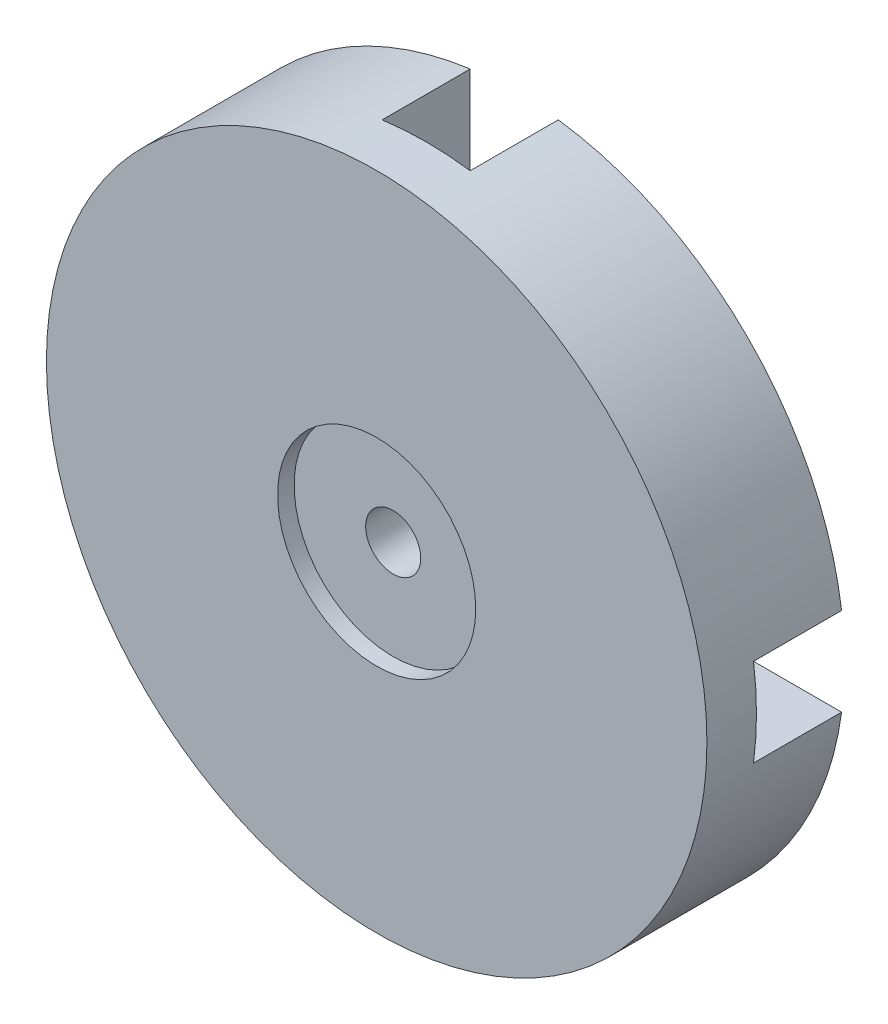
ISO-10303-21;
HEADER;
FILE_DESCRIPTION(('STEP AP214'),'2;1');
FILE_NAME('part.step','',(''),(''),'','','');
FILE_SCHEMA(('AUTOMOTIVE_DESIGN { 1 0 10303 214 1 1 1 1 }'));
ENDSEC;
DATA;
#1=APPLICATION_CONTEXT('core data for automotive mechanical design processes');
#2=APPLICATION_PROTOCOL_DEFINITION('international standard','automotive_design',2000,#1);
#3=PRODUCT_CONTEXT('',#1,'mechanical');
#4=PRODUCT('Part','Part','',(#3));
#5=PRODUCT_RELATED_PRODUCT_CATEGORY('part','',(#4));
#6=PRODUCT_DEFINITION_FORMATION('','',#4);
#7=PRODUCT_DEFINITION_CONTEXT('part definition',#1,'design');
#8=PRODUCT_DEFINITION('design','',#6,#7);
#9=PRODUCT_DEFINITION_SHAPE('','',#8);
#10=(LENGTH_UNIT() NAMED_UNIT(*) SI_UNIT(.MILLI.,.METRE.));
#11=(NAMED_UNIT(*) PLANE_ANGLE_UNIT() SI_UNIT($,.RADIAN.));
#12=(NAMED_UNIT(*) SI_UNIT($,.STERADIAN.) SOLID_ANGLE_UNIT());
#13=UNCERTAINTY_MEASURE_WITH_UNIT(LENGTH_MEASURE(1.E-05),#10,'distance_accuracy_value','');
#14=(GEOMETRIC_REPRESENTATION_CONTEXT(3) GLOBAL_UNCERTAINTY_ASSIGNED_CONTEXT((#13)) GLOBAL_UNIT_ASSIGNED_CONTEXT((#10,
#11,#12)) REPRESENTATION_CONTEXT('',''));
#15=CARTESIAN_POINT('',(0.,0.,0.));
#16=DIRECTION('',(0.,0.,1.));
#17=DIRECTION('',(1.,0.,0.));
#18=AXIS2_PLACEMENT_3D('',#15,#16,#17);
#19=CARTESIAN_POINT('',(0.,0.,25.));
#20=DIRECTION('',(0.,0.,-1.));
#21=DIRECTION('',(-1.,0.,0.));
#22=AXIS2_PLACEMENT_3D('',#19,#20,#21);
#23=CYLINDRICAL_SURFACE('',#22,60.);
#24=CARTESIAN_POINT('',(0.,0.,0.));
#25=DIRECTION('',(0.,0.,1.));
#26=DIRECTION('',(1.,0.,0.));
#27=AXIS2_PLACEMENT_3D('',#24,#25,#26);
#28=CIRCLE('',#27,60.);
#29=CARTESIAN_POINT('',(-7.99999999999999,59.464274989274,0.));
#30=VERTEX_POINT('',#29);
#31=CARTESIAN_POINT('',(-59.464274989274,8.,0.));
#32=VERTEX_POINT('',#31);
#33=EDGE_CURVE('E317',#30,#32,#28,.T.);
#34=ORIENTED_EDGE('',*,*,#33,.T.);
#35=DIRECTION('',(0.,0.,-1.));
#36=VECTOR('',#35,1.);
#37=CARTESIAN_POINT('',(-59.464274989274,8.,25.));
#38=LINE('',#37,#36);
#39=CARTESIAN_POINT('',(-59.464274989274,8.,16.));
#40=VERTEX_POINT('',#39);
#41=EDGE_CURVE('E242',#32,#40,#38,.F.);
#42=ORIENTED_EDGE('',*,*,#41,.T.);
#43=CARTESIAN_POINT('',(0.,0.,16.));
#44=DIRECTION('',(0.,0.,1.));
#45=DIRECTION('',(1.,0.,0.));
#46=AXIS2_PLACEMENT_3D('',#43,#44,#45);
#47=CIRCLE('',#46,60.);
#48=CARTESIAN_POINT('',(-59.464274989274,-8.,16.));
#49=VERTEX_POINT('',#48);
#50=EDGE_CURVE('E11',#40,#49,#47,.T.);
#51=ORIENTED_EDGE('',*,*,#50,.T.);
#52=DIRECTION('',(0.,0.,-1.));
#53=VECTOR('',#52,1.);
#54=CARTESIAN_POINT('',(-59.464274989274,-8.,25.));
#55=LINE('',#54,#53);
#56=CARTESIAN_POINT('',(-59.464274989274,-8.,0.));
#57=VERTEX_POINT('',#56);
#58=EDGE_CURVE('E159',#49,#57,#55,.T.);
#59=ORIENTED_EDGE('',*,*,#58,.T.);
#60=CARTESIAN_POINT('',(-8.,-59.464274989274,0.));
#61=VERTEX_POINT('',#60);
#62=EDGE_CURVE('E263',#57,#61,#28,.T.);
#63=ORIENTED_EDGE('',*,*,#62,.T.);
#64=DIRECTION('',(0.,0.,-1.));
#65=VECTOR('',#64,1.);
#66=CARTESIAN_POINT('',(-8.,-59.464274989274,25.));
#67=LINE('',#66,#65);
#68=CARTESIAN_POINT('',(-8.,-59.464274989274,16.));
#69=VERTEX_POINT('',#68);
#70=EDGE_CURVE('E238',#61,#69,#67,.F.);
#71=ORIENTED_EDGE('',*,*,#70,.T.);
#72=CARTESIAN_POINT('',(0.,0.,16.));
#73=DIRECTION('',(0.,0.,1.));
#74=DIRECTION('',(1.,0.,0.));
#75=AXIS2_PLACEMENT_3D('',#72,#73,#74);
#76=CIRCLE('',#75,60.);
#77=CARTESIAN_POINT('',(7.99999999999999,-59.464274989274,16.));
#78=VERTEX_POINT('',#77);
#79=EDGE_CURVE('E40',#69,#78,#76,.T.);
#80=ORIENTED_EDGE('',*,*,#79,.T.);
#81=DIRECTION('',(0.,0.,-1.));
#82=VECTOR('',#81,1.);
#83=CARTESIAN_POINT('',(8.,-59.464274989274,25.));
#84=LINE('',#83,#82);
#85=CARTESIAN_POINT('',(8.,-59.464274989274,0.));
#86=VERTEX_POINT('',#85);
#87=EDGE_CURVE('E235',#78,#86,#84,.T.);
#88=ORIENTED_EDGE('',*,*,#87,.T.);
#89=CARTESIAN_POINT('',(59.464274989274,-8.00000000000001,0.));
#90=VERTEX_POINT('',#89);
#91=EDGE_CURVE('E252',#86,#90,#28,.T.);
#92=ORIENTED_EDGE('',*,*,#91,.T.);
#93=DIRECTION('',(0.,0.,-1.));
#94=VECTOR('',#93,1.);
#95=CARTESIAN_POINT('',(59.464274989274,-8.00000000000001,25.));
#96=LINE('',#95,#94);
#97=CARTESIAN_POINT('',(59.464274989274,-8.,16.));
#98=VERTEX_POINT('',#97);
#99=EDGE_CURVE('E232',#90,#98,#96,.F.);
#100=ORIENTED_EDGE('',*,*,#99,.T.);
#101=CARTESIAN_POINT('',(0.,0.,16.));
#102=DIRECTION('',(0.,0.,1.));
#103=DIRECTION('',(1.,0.,0.));
#104=AXIS2_PLACEMENT_3D('',#101,#102,#103);
#105=CIRCLE('',#104,60.);
#106=CARTESIAN_POINT('',(59.464274989274,7.99999999999999,16.));
#107=VERTEX_POINT('',#106);
#108=EDGE_CURVE('E280',#98,#107,#105,.T.);
#109=ORIENTED_EDGE('',*,*,#108,.T.);
#110=DIRECTION('',(0.,0.,-1.));
#111=VECTOR('',#110,1.);
#112=CARTESIAN_POINT('',(59.464274989274,7.99999999999999,25.));
#113=LINE('',#112,#111);
#114=CARTESIAN_POINT('',(59.464274989274,7.99999999999999,0.));
#115=VERTEX_POINT('',#114);
#116=EDGE_CURVE('E229',#107,#115,#113,.T.);
#117=ORIENTED_EDGE('',*,*,#116,.T.);
#118=CARTESIAN_POINT('',(8.00000000000001,59.464274989274,0.));
#119=VERTEX_POINT('',#118);
#120=EDGE_CURVE('E260',#115,#119,#28,.T.);
#121=ORIENTED_EDGE('',*,*,#120,.T.);
#122=DIRECTION('',(0.,0.,-1.));
#123=VECTOR('',#122,1.);
#124=CARTESIAN_POINT('',(8.00000000000001,59.464274989274,25.));
#125=LINE('',#124,#123);
#126=CARTESIAN_POINT('',(8.00000000000001,59.464274989274,16.));
#127=VERTEX_POINT('',#126);
#128=EDGE_CURVE('E226',#119,#127,#125,.F.);
#129=ORIENTED_EDGE('',*,*,#128,.T.);
#130=CARTESIAN_POINT('',(0.,0.,16.));
#131=DIRECTION('',(0.,0.,1.));
#132=DIRECTION('',(1.,0.,0.));
#133=AXIS2_PLACEMENT_3D('',#130,#131,#132);
#134=CIRCLE('',#133,60.);
#135=CARTESIAN_POINT('',(-7.99999999999999,59.464274989274,16.));
#136=VERTEX_POINT('',#135);
#137=EDGE_CURVE('E277',#127,#136,#134,.T.);
#138=ORIENTED_EDGE('',*,*,#137,.T.);
#139=DIRECTION('',(0.,0.,-1.));
#140=VECTOR('',#139,1.);
#141=CARTESIAN_POINT('',(-7.99999999999999,59.464274989274,25.));
#142=LINE('',#141,#140);
#143=EDGE_CURVE('E172',#136,#30,#142,.T.);
#144=ORIENTED_EDGE('',*,*,#143,.T.);
#145=EDGE_LOOP('',(#34,#42,#51,#59,#63,#71,#80,#88,#92,#100,#109,#117,#121,#129,#138,#144));
#146=FACE_BOUND('',#145,.T.);
#147=CARTESIAN_POINT('',(0.,0.,25.));
#148=DIRECTION('',(0.,0.,1.));
#149=DIRECTION('',(1.,0.,0.));
#150=AXIS2_PLACEMENT_3D('',#147,#148,#149);
#151=CIRCLE('',#150,60.);
#152=CARTESIAN_POINT('',(60.,0.,25.));
#153=VERTEX_POINT('',#152);
#154=EDGE_CURVE('E256',#153,#153,#151,.T.);
#155=ORIENTED_EDGE('',*,*,#154,.F.);
#156=EDGE_LOOP('',(#155));
#157=FACE_BOUND('',#156,.T.);
#158=ADVANCED_FACE('F33',(#146,#157),#23,.T.);
#159=CARTESIAN_POINT('',(0.,0.,25.));
#160=DIRECTION('',(0.,0.,1.));
#161=DIRECTION('',(1.,0.,0.));
#162=AXIS2_PLACEMENT_3D('',#159,#160,#161);
#163=PLANE('',#162);
#164=CARTESIAN_POINT('',(0.,0.,25.));
#165=DIRECTION('',(0.,0.,1.));
#166=DIRECTION('',(1.,0.,0.));
#167=AXIS2_PLACEMENT_3D('',#164,#165,#166);
#168=CIRCLE('',#167,18.);
#169=CARTESIAN_POINT('',(18.,0.,25.));
#170=VERTEX_POINT('',#169);
#171=EDGE_CURVE('E253',#170,#170,#168,.T.);
#172=ORIENTED_EDGE('',*,*,#171,.F.);
#173=EDGE_LOOP('',(#172));
#174=FACE_BOUND('',#173,.T.);
#175=ORIENTED_EDGE('',*,*,#154,.T.);
#176=EDGE_LOOP('',(#175));
#177=FACE_BOUND('',#176,.T.);
#178=ADVANCED_FACE('F332',(#174,#177),#163,.T.);
#179=CARTESIAN_POINT('',(0.,0.,0.));
#180=DIRECTION('',(0.,0.,1.));
#181=DIRECTION('',(1.,0.,0.));
#182=AXIS2_PLACEMENT_3D('',#179,#180,#181);
#183=PLANE('',#182);
#184=CARTESIAN_POINT('',(0.,0.,0.));
#185=DIRECTION('',(0.,0.,1.));
#186=DIRECTION('',(1.,0.,0.));
#187=AXIS2_PLACEMENT_3D('',#184,#185,#186);
#188=CIRCLE('',#187,5.);
#189=CARTESIAN_POINT('',(5.,0.,0.));
#190=VERTEX_POINT('',#189);
#191=EDGE_CURVE('E245',#190,#190,#188,.T.);
#192=ORIENTED_EDGE('',*,*,#191,.T.);
#193=EDGE_LOOP('',(#192));
#194=FACE_BOUND('',#193,.T.);
#195=DIRECTION('',(0.,-1.,0.));
#196=VECTOR('',#195,1.);
#197=CARTESIAN_POINT('',(-15.,-8.,0.));
#198=LINE('',#197,#196);
#199=CARTESIAN_POINT('',(-15.,8.,0.));
#200=VERTEX_POINT('',#199);
#201=CARTESIAN_POINT('',(-15.,-8.,0.));
#202=VERTEX_POINT('',#201);
#203=EDGE_CURVE('E47',#200,#202,#198,.T.);
#204=ORIENTED_EDGE('',*,*,#203,.F.);
#205=DIRECTION('',(-1.,0.,0.));
#206=VECTOR('',#205,1.);
#207=CARTESIAN_POINT('',(0.,8.,0.));
#208=LINE('',#207,#206);
#209=EDGE_CURVE('E274',#200,#32,#208,.T.);
#210=ORIENTED_EDGE('',*,*,#209,.T.);
#211=ORIENTED_EDGE('',*,*,#33,.F.);
#212=DIRECTION('',(0.,1.,0.));
#213=VECTOR('',#212,1.);
#214=CARTESIAN_POINT('',(-8.,15.,0.));
#215=LINE('',#214,#213);
#216=CARTESIAN_POINT('',(-8.,15.,0.));
#217=VERTEX_POINT('',#216);
#218=EDGE_CURVE('E211',#217,#30,#215,.T.);
#219=ORIENTED_EDGE('',*,*,#218,.F.);
#220=DIRECTION('',(-1.,0.,0.));
#221=VECTOR('',#220,1.);
#222=CARTESIAN_POINT('',(-8.,15.,0.));
#223=LINE('',#222,#221);
#224=CARTESIAN_POINT('',(8.,15.,0.));
#225=VERTEX_POINT('',#224);
#226=EDGE_CURVE('E217',#225,#217,#223,.T.);
#227=ORIENTED_EDGE('',*,*,#226,.F.);
#228=DIRECTION('',(0.,1.,0.));
#229=VECTOR('',#228,1.);
#230=CARTESIAN_POINT('',(8.,0.,0.));
#231=LINE('',#230,#229);
#232=EDGE_CURVE('E259',#225,#119,#231,.T.);
#233=ORIENTED_EDGE('',*,*,#232,.T.);
#234=ORIENTED_EDGE('',*,*,#120,.F.);
#235=DIRECTION('',(1.,0.,0.));
#236=VECTOR('',#235,1.);
#237=CARTESIAN_POINT('',(15.,8.,0.));
#238=LINE('',#237,#236);
#239=CARTESIAN_POINT('',(15.,8.,0.));
#240=VERTEX_POINT('',#239);
#241=EDGE_CURVE('E193',#240,#115,#238,.T.);
#242=ORIENTED_EDGE('',*,*,#241,.F.);
#243=DIRECTION('',(0.,1.,0.));
#244=VECTOR('',#243,1.);
#245=CARTESIAN_POINT('',(15.,8.,0.));
#246=LINE('',#245,#244);
#247=CARTESIAN_POINT('',(15.,-8.,0.));
#248=VERTEX_POINT('',#247);
#249=EDGE_CURVE('E199',#248,#240,#246,.T.);
#250=ORIENTED_EDGE('',*,*,#249,.F.);
#251=DIRECTION('',(1.,0.,0.));
#252=VECTOR('',#251,1.);
#253=CARTESIAN_POINT('',(0.,-8.,0.));
#254=LINE('',#253,#252);
#255=EDGE_CURVE('E268',#248,#90,#254,.T.);
#256=ORIENTED_EDGE('',*,*,#255,.T.);
#257=ORIENTED_EDGE('',*,*,#91,.F.);
#258=DIRECTION('',(0.,-1.,0.));
#259=VECTOR('',#258,1.);
#260=CARTESIAN_POINT('',(8.,-15.,0.));
#261=LINE('',#260,#259);
#262=CARTESIAN_POINT('',(8.,-15.,0.));
#263=VERTEX_POINT('',#262);
#264=EDGE_CURVE('E178',#263,#86,#261,.T.);
#265=ORIENTED_EDGE('',*,*,#264,.F.);
#266=DIRECTION('',(1.,0.,0.));
#267=VECTOR('',#266,1.);
#268=CARTESIAN_POINT('',(8.,-15.,0.));
#269=LINE('',#268,#267);
#270=CARTESIAN_POINT('',(-8.,-15.,0.));
#271=VERTEX_POINT('',#270);
#272=EDGE_CURVE('E55',#271,#263,#269,.T.);
#273=ORIENTED_EDGE('',*,*,#272,.F.);
#274=DIRECTION('',(0.,-1.,0.));
#275=VECTOR('',#274,1.);
#276=CARTESIAN_POINT('',(-8.,0.,0.));
#277=LINE('',#276,#275);
#278=EDGE_CURVE('E271',#271,#61,#277,.T.);
#279=ORIENTED_EDGE('',*,*,#278,.T.);
#280=ORIENTED_EDGE('',*,*,#62,.F.);
#281=DIRECTION('',(-1.,0.,0.));
#282=VECTOR('',#281,1.);
#283=CARTESIAN_POINT('',(-15.,-8.,0.));
#284=LINE('',#283,#282);
#285=EDGE_CURVE('E165',#202,#57,#284,.T.);
#286=ORIENTED_EDGE('',*,*,#285,.F.);
#287=EDGE_LOOP('',(#204,#210,#211,#219,#227,#233,#234,#242,#250,#256,#257,#265,#273,#279,#280,#286));
#288=FACE_BOUND('',#287,.T.);
#289=ADVANCED_FACE('F300',(#194,#288),#183,.F.);
#290=CARTESIAN_POINT('',(0.,0.,22.));
#291=DIRECTION('',(0.,0.,1.));
#292=DIRECTION('',(1.,0.,0.));
#293=AXIS2_PLACEMENT_3D('',#290,#291,#292);
#294=CYLINDRICAL_SURFACE('',#293,18.);
#295=CARTESIAN_POINT('',(0.,0.,22.));
#296=DIRECTION('',(0.,0.,1.));
#297=DIRECTION('',(1.,0.,0.));
#298=AXIS2_PLACEMENT_3D('',#295,#296,#297);
#299=CIRCLE('',#298,18.);
#300=CARTESIAN_POINT('',(18.,0.,22.));
#301=VERTEX_POINT('',#300);
#302=EDGE_CURVE('E249',#301,#301,#299,.T.);
#303=ORIENTED_EDGE('',*,*,#302,.F.);
#304=EDGE_LOOP('',(#303));
#305=FACE_BOUND('',#304,.T.);
#306=ORIENTED_EDGE('',*,*,#171,.T.);
#307=EDGE_LOOP('',(#306));
#308=FACE_BOUND('',#307,.T.);
#309=ADVANCED_FACE('F341',(#305,#308),#294,.F.);
#310=CARTESIAN_POINT('',(0.,0.,22.));
#311=DIRECTION('',(0.,0.,1.));
#312=DIRECTION('',(1.,0.,0.));
#313=AXIS2_PLACEMENT_3D('',#310,#311,#312);
#314=PLANE('',#313);
#315=CARTESIAN_POINT('',(0.,0.,22.));
#316=DIRECTION('',(0.,0.,1.));
#317=DIRECTION('',(1.,0.,0.));
#318=AXIS2_PLACEMENT_3D('',#315,#316,#317);
#319=CIRCLE('',#318,5.);
#320=CARTESIAN_POINT('',(5.,0.,22.));
#321=VERTEX_POINT('',#320);
#322=EDGE_CURVE('E248',#321,#321,#319,.T.);
#323=ORIENTED_EDGE('',*,*,#322,.F.);
#324=EDGE_LOOP('',(#323));
#325=FACE_BOUND('',#324,.T.);
#326=ORIENTED_EDGE('',*,*,#302,.T.);
#327=EDGE_LOOP('',(#326));
#328=FACE_BOUND('',#327,.T.);
#329=ADVANCED_FACE('F348',(#325,#328),#314,.T.);
#330=CARTESIAN_POINT('',(0.,0.,0.));
#331=DIRECTION('',(0.,0.,1.));
#332=DIRECTION('',(1.,0.,0.));
#333=AXIS2_PLACEMENT_3D('',#330,#331,#332);
#334=CYLINDRICAL_SURFACE('',#333,5.);
#335=ORIENTED_EDGE('',*,*,#322,.T.);
#336=EDGE_LOOP('',(#335));
#337=FACE_BOUND('',#336,.T.);
#338=ORIENTED_EDGE('',*,*,#191,.F.);
#339=EDGE_LOOP('',(#338));
#340=FACE_BOUND('',#339,.T.);
#341=ADVANCED_FACE('F352',(#337,#340),#334,.F.);
#342=CARTESIAN_POINT('',(0.,0.,16.));
#343=DIRECTION('',(0.,0.,1.));
#344=DIRECTION('',(1.,0.,0.));
#345=AXIS2_PLACEMENT_3D('',#342,#343,#344);
#346=PLANE('',#345);
#347=DIRECTION('',(0.,-1.,0.));
#348=VECTOR('',#347,1.);
#349=CARTESIAN_POINT('',(8.,15.,16.));
#350=LINE('',#349,#348);
#351=CARTESIAN_POINT('',(8.,15.,16.));
#352=VERTEX_POINT('',#351);
#353=EDGE_CURVE('E214',#127,#352,#350,.T.);
#354=ORIENTED_EDGE('',*,*,#353,.T.);
#355=DIRECTION('',(-1.,0.,0.));
#356=VECTOR('',#355,1.);
#357=CARTESIAN_POINT('',(-8.,15.,16.));
#358=LINE('',#357,#356);
#359=CARTESIAN_POINT('',(-8.,15.,16.));
#360=VERTEX_POINT('',#359);
#361=EDGE_CURVE('E207',#352,#360,#358,.T.);
#362=ORIENTED_EDGE('',*,*,#361,.T.);
#363=DIRECTION('',(0.,1.,0.));
#364=VECTOR('',#363,1.);
#365=CARTESIAN_POINT('',(-8.,15.,16.));
#366=LINE('',#365,#364);
#367=EDGE_CURVE('E210',#360,#136,#366,.T.);
#368=ORIENTED_EDGE('',*,*,#367,.T.);
#369=ORIENTED_EDGE('',*,*,#137,.F.);
#370=EDGE_LOOP('',(#354,#362,#368,#369));
#371=FACE_BOUND('',#370,.T.);
#372=ADVANCED_FACE('F356',(#371),#346,.F.);
#373=CARTESIAN_POINT('',(8.,15.,16.));
#374=DIRECTION('',(1.,0.,0.));
#375=DIRECTION('',(0.,1.,0.));
#376=AXIS2_PLACEMENT_3D('',#373,#374,#375);
#377=PLANE('',#376);
#378=ORIENTED_EDGE('',*,*,#232,.F.);
#379=DIRECTION('',(0.,0.,-1.));
#380=VECTOR('',#379,1.);
#381=CARTESIAN_POINT('',(8.,15.,16.));
#382=LINE('',#381,#380);
#383=EDGE_CURVE('E201',#352,#225,#382,.T.);
#384=ORIENTED_EDGE('',*,*,#383,.F.);
#385=ORIENTED_EDGE('',*,*,#353,.F.);
#386=ORIENTED_EDGE('',*,*,#128,.F.);
#387=EDGE_LOOP('',(#378,#384,#385,#386));
#388=FACE_BOUND('',#387,.T.);
#389=ADVANCED_FACE('F365',(#388),#377,.F.);
#390=CARTESIAN_POINT('',(-8.,15.,16.));
#391=DIRECTION('',(-1.,0.,0.));
#392=DIRECTION('',(0.,-1.,0.));
#393=AXIS2_PLACEMENT_3D('',#390,#391,#392);
#394=PLANE('',#393);
#395=ORIENTED_EDGE('',*,*,#367,.F.);
#396=DIRECTION('',(0.,0.,-1.));
#397=VECTOR('',#396,1.);
#398=CARTESIAN_POINT('',(-8.,15.,16.));
#399=LINE('',#398,#397);
#400=EDGE_CURVE('E216',#360,#217,#399,.T.);
#401=ORIENTED_EDGE('',*,*,#400,.T.);
#402=ORIENTED_EDGE('',*,*,#218,.T.);
#403=ORIENTED_EDGE('',*,*,#143,.F.);
#404=EDGE_LOOP('',(#395,#401,#402,#403));
#405=FACE_BOUND('',#404,.T.);
#406=ADVANCED_FACE('F361',(#405),#394,.F.);
#407=CARTESIAN_POINT('',(-8.,15.,16.));
#408=DIRECTION('',(0.,-1.,0.));
#409=DIRECTION('',(1.,0.,0.));
#410=AXIS2_PLACEMENT_3D('',#407,#408,#409);
#411=PLANE('',#410);
#412=ORIENTED_EDGE('',*,*,#226,.T.);
#413=ORIENTED_EDGE('',*,*,#400,.F.);
#414=ORIENTED_EDGE('',*,*,#361,.F.);
#415=ORIENTED_EDGE('',*,*,#383,.T.);
#416=EDGE_LOOP('',(#412,#413,#414,#415));
#417=FACE_BOUND('',#416,.T.);
#418=ADVANCED_FACE('F358',(#417),#411,.F.);
#419=CARTESIAN_POINT('',(0.,0.,16.));
#420=DIRECTION('',(0.,0.,1.));
#421=DIRECTION('',(1.,0.,0.));
#422=AXIS2_PLACEMENT_3D('',#419,#420,#421);
#423=PLANE('',#422);
#424=ORIENTED_EDGE('',*,*,#108,.F.);
#425=DIRECTION('',(-1.,0.,0.));
#426=VECTOR('',#425,1.);
#427=CARTESIAN_POINT('',(15.,-8.,16.));
#428=LINE('',#427,#426);
#429=CARTESIAN_POINT('',(15.,-8.,16.));
#430=VERTEX_POINT('',#429);
#431=EDGE_CURVE('E196',#98,#430,#428,.T.);
#432=ORIENTED_EDGE('',*,*,#431,.T.);
#433=DIRECTION('',(0.,1.,0.));
#434=VECTOR('',#433,1.);
#435=CARTESIAN_POINT('',(15.,8.,16.));
#436=LINE('',#435,#434);
#437=CARTESIAN_POINT('',(15.,8.,16.));
#438=VERTEX_POINT('',#437);
#439=EDGE_CURVE('E189',#430,#438,#436,.T.);
#440=ORIENTED_EDGE('',*,*,#439,.T.);
#441=DIRECTION('',(1.,0.,0.));
#442=VECTOR('',#441,1.);
#443=CARTESIAN_POINT('',(15.,8.,16.));
#444=LINE('',#443,#442);
#445=EDGE_CURVE('E192',#438,#107,#444,.T.);
#446=ORIENTED_EDGE('',*,*,#445,.T.);
#447=EDGE_LOOP('',(#424,#432,#440,#446));
#448=FACE_BOUND('',#447,.T.);
#449=ADVANCED_FACE('F309',(#448),#423,.F.);
#450=CARTESIAN_POINT('',(15.,-8.,16.));
#451=DIRECTION('',(0.,-1.,0.));
#452=DIRECTION('',(1.,0.,0.));
#453=AXIS2_PLACEMENT_3D('',#450,#451,#452);
#454=PLANE('',#453);
#455=ORIENTED_EDGE('',*,*,#255,.F.);
#456=DIRECTION('',(0.,0.,-1.));
#457=VECTOR('',#456,1.);
#458=CARTESIAN_POINT('',(15.,-8.,16.));
#459=LINE('',#458,#457);
#460=EDGE_CURVE('E185',#430,#248,#459,.T.);
#461=ORIENTED_EDGE('',*,*,#460,.F.);
#462=ORIENTED_EDGE('',*,*,#431,.F.);
#463=ORIENTED_EDGE('',*,*,#99,.F.);
#464=EDGE_LOOP('',(#455,#461,#462,#463));
#465=FACE_BOUND('',#464,.T.);
#466=ADVANCED_FACE('F305',(#465),#454,.F.);
#467=CARTESIAN_POINT('',(15.,8.,16.));
#468=DIRECTION('',(0.,1.,0.));
#469=DIRECTION('',(-1.,0.,0.));
#470=AXIS2_PLACEMENT_3D('',#467,#468,#469);
#471=PLANE('',#470);
#472=ORIENTED_EDGE('',*,*,#445,.F.);
#473=DIRECTION('',(0.,0.,-1.));
#474=VECTOR('',#473,1.);
#475=CARTESIAN_POINT('',(15.,8.,16.));
#476=LINE('',#475,#474);
#477=EDGE_CURVE('E198',#438,#240,#476,.T.);
#478=ORIENTED_EDGE('',*,*,#477,.T.);
#479=ORIENTED_EDGE('',*,*,#241,.T.);
#480=ORIENTED_EDGE('',*,*,#116,.F.);
#481=EDGE_LOOP('',(#472,#478,#479,#480));
#482=FACE_BOUND('',#481,.T.);
#483=ADVANCED_FACE('F312',(#482),#471,.F.);
#484=CARTESIAN_POINT('',(15.,8.,16.));
#485=DIRECTION('',(-1.,0.,0.));
#486=DIRECTION('',(0.,-1.,0.));
#487=AXIS2_PLACEMENT_3D('',#484,#485,#486);
#488=PLANE('',#487);
#489=ORIENTED_EDGE('',*,*,#249,.T.);
#490=ORIENTED_EDGE('',*,*,#477,.F.);
#491=ORIENTED_EDGE('',*,*,#439,.F.);
#492=ORIENTED_EDGE('',*,*,#460,.T.);
#493=EDGE_LOOP('',(#489,#490,#491,#492));
#494=FACE_BOUND('',#493,.T.);
#495=ADVANCED_FACE('F373',(#494),#488,.F.);
#496=CARTESIAN_POINT('',(0.,0.,16.));
#497=DIRECTION('',(0.,0.,1.));
#498=DIRECTION('',(1.,0.,0.));
#499=AXIS2_PLACEMENT_3D('',#496,#497,#498);
#500=PLANE('',#499);
#501=DIRECTION('',(0.,1.,0.));
#502=VECTOR('',#501,1.);
#503=CARTESIAN_POINT('',(-8.,-15.,16.));
#504=LINE('',#503,#502);
#505=CARTESIAN_POINT('',(-8.,-15.,16.));
#506=VERTEX_POINT('',#505);
#507=EDGE_CURVE('E181',#69,#506,#504,.T.);
#508=ORIENTED_EDGE('',*,*,#507,.T.);
#509=DIRECTION('',(1.,0.,0.));
#510=VECTOR('',#509,1.);
#511=CARTESIAN_POINT('',(8.,-15.,16.));
#512=LINE('',#511,#510);
#513=CARTESIAN_POINT('',(8.,-15.,16.));
#514=VERTEX_POINT('',#513);
#515=EDGE_CURVE('E174',#506,#514,#512,.T.);
#516=ORIENTED_EDGE('',*,*,#515,.T.);
#517=DIRECTION('',(0.,-1.,0.));
#518=VECTOR('',#517,1.);
#519=CARTESIAN_POINT('',(8.,-15.,16.));
#520=LINE('',#519,#518);
#521=EDGE_CURVE('E177',#514,#78,#520,.T.);
#522=ORIENTED_EDGE('',*,*,#521,.T.);
#523=ORIENTED_EDGE('',*,*,#79,.F.);
#524=EDGE_LOOP('',(#508,#516,#522,#523));
#525=FACE_BOUND('',#524,.T.);
#526=ADVANCED_FACE('F289',(#525),#500,.F.);
#527=CARTESIAN_POINT('',(-8.,-15.,16.));
#528=DIRECTION('',(-1.,0.,0.));
#529=DIRECTION('',(0.,-1.,0.));
#530=AXIS2_PLACEMENT_3D('',#527,#528,#529);
#531=PLANE('',#530);
#532=ORIENTED_EDGE('',*,*,#278,.F.);
#533=DIRECTION('',(0.,0.,-1.));
#534=VECTOR('',#533,1.);
#535=CARTESIAN_POINT('',(-8.,-15.,16.));
#536=LINE('',#535,#534);
#537=EDGE_CURVE('E170',#506,#271,#536,.T.);
#538=ORIENTED_EDGE('',*,*,#537,.F.);
#539=ORIENTED_EDGE('',*,*,#507,.F.);
#540=ORIENTED_EDGE('',*,*,#70,.F.);
#541=EDGE_LOOP('',(#532,#538,#539,#540));
#542=FACE_BOUND('',#541,.T.);
#543=ADVANCED_FACE('F293',(#542),#531,.F.);
#544=CARTESIAN_POINT('',(8.,-15.,16.));
#545=DIRECTION('',(1.,0.,0.));
#546=DIRECTION('',(0.,1.,0.));
#547=AXIS2_PLACEMENT_3D('',#544,#545,#546);
#548=PLANE('',#547);
#549=ORIENTED_EDGE('',*,*,#521,.F.);
#550=DIRECTION('',(0.,0.,-1.));
#551=VECTOR('',#550,1.);
#552=CARTESIAN_POINT('',(8.,-15.,16.));
#553=LINE('',#552,#551);
#554=EDGE_CURVE('E183',#514,#263,#553,.T.);
#555=ORIENTED_EDGE('',*,*,#554,.T.);
#556=ORIENTED_EDGE('',*,*,#264,.T.);
#557=ORIENTED_EDGE('',*,*,#87,.F.);
#558=EDGE_LOOP('',(#549,#555,#556,#557));
#559=FACE_BOUND('',#558,.T.);
#560=ADVANCED_FACE('F298',(#559),#548,.F.);
#561=CARTESIAN_POINT('',(8.,-15.,16.));
#562=DIRECTION('',(0.,1.,0.));
#563=DIRECTION('',(0.,0.,1.));
#564=AXIS2_PLACEMENT_3D('',#561,#562,#563);
#565=PLANE('',#564);
#566=ORIENTED_EDGE('',*,*,#272,.T.);
#567=ORIENTED_EDGE('',*,*,#554,.F.);
#568=ORIENTED_EDGE('',*,*,#515,.F.);
#569=ORIENTED_EDGE('',*,*,#537,.T.);
#570=EDGE_LOOP('',(#566,#567,#568,#569));
#571=FACE_BOUND('',#570,.T.);
#572=ADVANCED_FACE('F295',(#571),#565,.F.);
#573=CARTESIAN_POINT('',(0.,0.,16.));
#574=DIRECTION('',(0.,0.,1.));
#575=DIRECTION('',(1.,0.,0.));
#576=AXIS2_PLACEMENT_3D('',#573,#574,#575);
#577=PLANE('',#576);
#578=DIRECTION('',(1.,0.,0.));
#579=VECTOR('',#578,1.);
#580=CARTESIAN_POINT('',(-15.,8.,16.));
#581=LINE('',#580,#579);
#582=CARTESIAN_POINT('',(-15.,8.,16.));
#583=VERTEX_POINT('',#582);
#584=EDGE_CURVE('E153',#40,#583,#581,.T.);
#585=ORIENTED_EDGE('',*,*,#584,.T.);
#586=DIRECTION('',(0.,-1.,0.));
#587=VECTOR('',#586,1.);
#588=CARTESIAN_POINT('',(-15.,-8.,16.));
#589=LINE('',#588,#587);
#590=CARTESIAN_POINT('',(-15.,-8.,16.));
#591=VERTEX_POINT('',#590);
#592=EDGE_CURVE('E149',#583,#591,#589,.T.);
#593=ORIENTED_EDGE('',*,*,#592,.T.);
#594=DIRECTION('',(-1.,0.,0.));
#595=VECTOR('',#594,1.);
#596=CARTESIAN_POINT('',(-15.,-8.,16.));
#597=LINE('',#596,#595);
#598=EDGE_CURVE('E156',#591,#49,#597,.T.);
#599=ORIENTED_EDGE('',*,*,#598,.T.);
#600=ORIENTED_EDGE('',*,*,#50,.F.);
#601=EDGE_LOOP('',(#585,#593,#599,#600));
#602=FACE_BOUND('',#601,.T.);
#603=ADVANCED_FACE('F162',(#602),#577,.F.);
#604=CARTESIAN_POINT('',(-15.,8.,16.));
#605=DIRECTION('',(0.,1.,0.));
#606=DIRECTION('',(0.,0.,1.));
#607=AXIS2_PLACEMENT_3D('',#604,#605,#606);
#608=PLANE('',#607);
#609=ORIENTED_EDGE('',*,*,#209,.F.);
#610=DIRECTION('',(0.,0.,-1.));
#611=VECTOR('',#610,1.);
#612=CARTESIAN_POINT('',(-15.,8.,16.));
#613=LINE('',#612,#611);
#614=EDGE_CURVE('E152',#583,#200,#613,.T.);
#615=ORIENTED_EDGE('',*,*,#614,.F.);
#616=ORIENTED_EDGE('',*,*,#584,.F.);
#617=ORIENTED_EDGE('',*,*,#41,.F.);
#618=EDGE_LOOP('',(#609,#615,#616,#617));
#619=FACE_BOUND('',#618,.T.);
#620=ADVANCED_FACE('F322',(#619),#608,.F.);
#621=CARTESIAN_POINT('',(-15.,-8.,16.));
#622=DIRECTION('',(0.,-1.,0.));
#623=DIRECTION('',(0.,0.,-1.));
#624=AXIS2_PLACEMENT_3D('',#621,#622,#623);
#625=PLANE('',#624);
#626=ORIENTED_EDGE('',*,*,#598,.F.);
#627=DIRECTION('',(0.,0.,-1.));
#628=VECTOR('',#627,1.);
#629=CARTESIAN_POINT('',(-15.,-8.,16.));
#630=LINE('',#629,#628);
#631=EDGE_CURVE('E145',#591,#202,#630,.T.);
#632=ORIENTED_EDGE('',*,*,#631,.T.);
#633=ORIENTED_EDGE('',*,*,#285,.T.);
#634=ORIENTED_EDGE('',*,*,#58,.F.);
#635=EDGE_LOOP('',(#626,#632,#633,#634));
#636=FACE_BOUND('',#635,.T.);
#637=ADVANCED_FACE('F157',(#636),#625,.F.);
#638=CARTESIAN_POINT('',(-15.,-8.,16.));
#639=DIRECTION('',(1.,0.,0.));
#640=DIRECTION('',(0.,0.,-1.));
#641=AXIS2_PLACEMENT_3D('',#638,#639,#640);
#642=PLANE('',#641);
#643=ORIENTED_EDGE('',*,*,#203,.T.);
#644=ORIENTED_EDGE('',*,*,#631,.F.);
#645=ORIENTED_EDGE('',*,*,#592,.F.);
#646=ORIENTED_EDGE('',*,*,#614,.T.);
#647=EDGE_LOOP('',(#643,#644,#645,#646));
#648=FACE_BOUND('',#647,.T.);
#649=ADVANCED_FACE('F147',(#648),#642,.F.);
#650=CLOSED_SHELL('',(#158,#178,#289,#309,#329,#341,#372,#389,#406,#418,#449,#466,#483,#495,
#526,#543,#560,#572,#603,#620,#637,#649));
#651=MANIFOLD_SOLID_BREP('B2',#650);
#652=ADVANCED_BREP_SHAPE_REPRESENTATION('',(#18,#651),#14);
#653=SHAPE_DEFINITION_REPRESENTATION(#9,#652);
ENDSEC;
END-ISO-10303-21;
